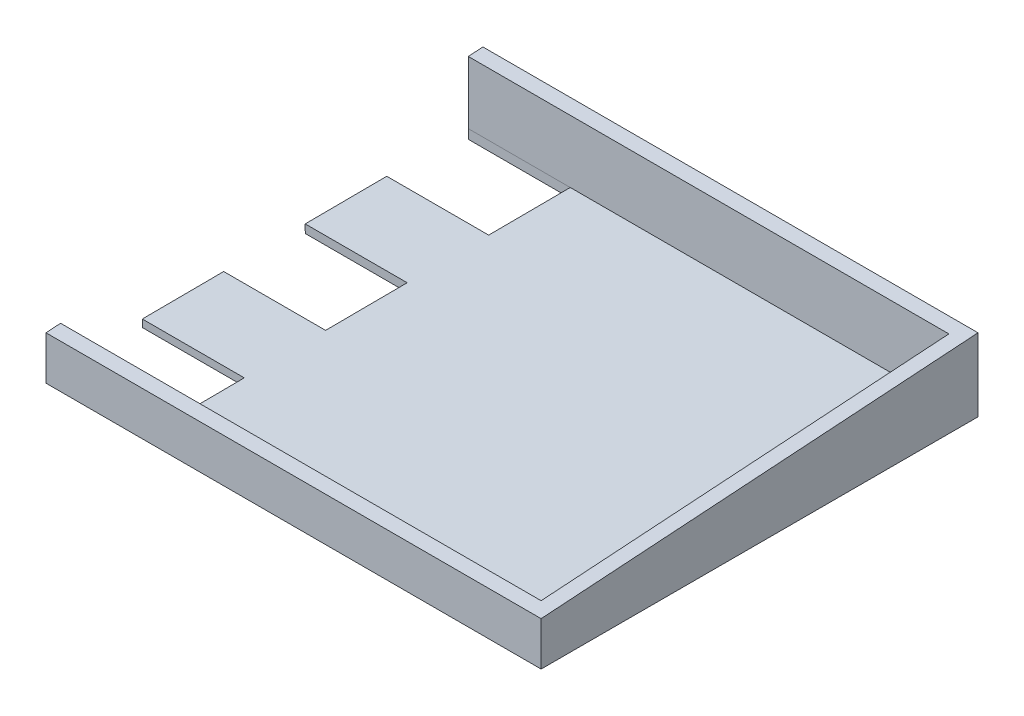
ISO-10303-21;
HEADER;
FILE_DESCRIPTION(('STEP AP214'),'2;1');
FILE_NAME('part.step','',(''),(''),'','','');
FILE_SCHEMA(('AUTOMOTIVE_DESIGN { 1 0 10303 214 1 1 1 1 }'));
ENDSEC;
DATA;
#1=APPLICATION_CONTEXT('core data for automotive mechanical design processes');
#2=APPLICATION_PROTOCOL_DEFINITION('international standard','automotive_design',2000,#1);
#3=PRODUCT_CONTEXT('',#1,'mechanical');
#4=PRODUCT('Part','Part','',(#3));
#5=PRODUCT_RELATED_PRODUCT_CATEGORY('part','',(#4));
#6=PRODUCT_DEFINITION_FORMATION('','',#4);
#7=PRODUCT_DEFINITION_CONTEXT('part definition',#1,'design');
#8=PRODUCT_DEFINITION('design','',#6,#7);
#9=PRODUCT_DEFINITION_SHAPE('','',#8);
#10=(LENGTH_UNIT() NAMED_UNIT(*) SI_UNIT(.MILLI.,.METRE.));
#11=(NAMED_UNIT(*) PLANE_ANGLE_UNIT() SI_UNIT($,.RADIAN.));
#12=(NAMED_UNIT(*) SI_UNIT($,.STERADIAN.) SOLID_ANGLE_UNIT());
#13=UNCERTAINTY_MEASURE_WITH_UNIT(LENGTH_MEASURE(1.E-05),#10,'distance_accuracy_value','');
#14=(GEOMETRIC_REPRESENTATION_CONTEXT(3) GLOBAL_UNCERTAINTY_ASSIGNED_CONTEXT((#13)) GLOBAL_UNIT_ASSIGNED_CONTEXT((#10,
#11,#12)) REPRESENTATION_CONTEXT('',''));
#15=CARTESIAN_POINT('',(0.,0.,0.));
#16=DIRECTION('',(0.,0.,1.));
#17=DIRECTION('',(1.,0.,0.));
#18=AXIS2_PLACEMENT_3D('',#15,#16,#17);
#19=CARTESIAN_POINT('',(-170.,0.,0.));
#20=DIRECTION('',(-1.,0.,0.));
#21=DIRECTION('',(0.,0.,1.));
#22=AXIS2_PLACEMENT_3D('',#19,#20,#21);
#23=PLANE('',#22);
#24=DIRECTION('',(0.,0.99998367386921,0.00571419242210977));
#25=VECTOR('',#24,1.);
#26=CARTESIAN_POINT('',(-170.,-15.6680463223183,-33.0918935943006));
#27=LINE('',#26,#25);
#28=CARTESIAN_POINT('',(-170.,-15.,-33.0880761867445));
#29=VERTEX_POINT('',#28);
#30=CARTESIAN_POINT('',(-170.,-12.4395803130451,-33.0734452171047));
#31=VERTEX_POINT('',#30);
#32=EDGE_CURVE('E208',#29,#31,#27,.T.);
#33=ORIENTED_EDGE('',*,*,#32,.T.);
#34=DIRECTION('',(0.,-0.00571419242210977,0.99998367386921));
#35=VECTOR('',#34,1.);
#36=CARTESIAN_POINT('',(-170.,-11.8,-145.));
#37=LINE('',#36,#35);
#38=CARTESIAN_POINT('',(-170.,-12.2799921634572,-61.0013713949864));
#39=VERTEX_POINT('',#38);
#40=EDGE_CURVE('E316',#39,#31,#37,.T.);
#41=ORIENTED_EDGE('',*,*,#40,.F.);
#42=DIRECTION('',(0.,0.99998367386921,0.00571419242210977));
#43=VECTOR('',#42,1.);
#44=CARTESIAN_POINT('',(-170.,-15.5084581727304,-61.0198197721822));
#45=LINE('',#44,#43);
#46=CARTESIAN_POINT('',(-170.,-15.,-61.0169142969095));
#47=VERTEX_POINT('',#46);
#48=EDGE_CURVE('E69',#47,#39,#45,.T.);
#49=ORIENTED_EDGE('',*,*,#48,.F.);
#50=DIRECTION('',(0.,0.,-1.));
#51=VECTOR('',#50,1.);
#52=CARTESIAN_POINT('',(-170.,-15.,-150.));
#53=LINE('',#52,#51);
#54=EDGE_CURVE('E349',#29,#47,#53,.T.);
#55=ORIENTED_EDGE('',*,*,#54,.F.);
#56=EDGE_LOOP('',(#33,#41,#49,#55));
#57=FACE_BOUND('',#56,.T.);
#58=ADVANCED_FACE('F43',(#57),#23,.T.);
#59=DIRECTION('',(0.,0.99998367386921,0.00571419242210977));
#60=VECTOR('',#59,1.);
#61=CARTESIAN_POINT('',(-170.,-15.3484607849113,-89.0193626405201));
#62=LINE('',#61,#60);
#63=CARTESIAN_POINT('',(-170.,-15.,-89.0173714360349));
#64=VERTEX_POINT('',#63);
#65=CARTESIAN_POINT('',(-170.,-12.1199947756382,-89.0009142633243));
#66=VERTEX_POINT('',#65);
#67=EDGE_CURVE('E234',#64,#66,#62,.T.);
#68=ORIENTED_EDGE('',*,*,#67,.T.);
#69=CARTESIAN_POINT('',(-170.,-11.9599973878191,-117.000457131662));
#70=VERTEX_POINT('',#69);
#71=EDGE_CURVE('E312',#70,#66,#37,.T.);
#72=ORIENTED_EDGE('',*,*,#71,.F.);
#73=DIRECTION('',(0.,0.99998367386921,0.00571419242210977));
#74=VECTOR('',#73,1.);
#75=CARTESIAN_POINT('',(-170.,-15.1884633970922,-117.018905508858));
#76=LINE('',#75,#74);
#77=CARTESIAN_POINT('',(-170.,-15.,-117.01782857516));
#78=VERTEX_POINT('',#77);
#79=EDGE_CURVE('E265',#78,#70,#76,.T.);
#80=ORIENTED_EDGE('',*,*,#79,.F.);
#81=EDGE_CURVE('E427',#64,#78,#53,.T.);
#82=ORIENTED_EDGE('',*,*,#81,.F.);
#83=EDGE_LOOP('',(#68,#72,#80,#82));
#84=FACE_BOUND('',#83,.T.);
#85=ADVANCED_FACE('F447',(#84),#23,.T.);
#86=DIRECTION('',(0.,0.99998367386921,0.00571419242210977));
#87=VECTOR('',#86,1.);
#88=CARTESIAN_POINT('',(-170.,-15.0284660092732,-145.018448377196));
#89=LINE('',#88,#87);
#90=CARTESIAN_POINT('',(-170.,-15.,-145.018285714286));
#91=VERTEX_POINT('',#90);
#92=CARTESIAN_POINT('',(-170.,-11.8,-145.));
#93=VERTEX_POINT('',#92);
#94=EDGE_CURVE('E266',#91,#93,#89,.T.);
#95=ORIENTED_EDGE('',*,*,#94,.T.);
#96=DIRECTION('',(0.,-1.,0.));
#97=VECTOR('',#96,1.);
#98=CARTESIAN_POINT('',(-170.,9.66666666666667,-145.));
#99=LINE('',#98,#97);
#100=CARTESIAN_POINT('',(-170.,9.66666666666668,-145.));
#101=VERTEX_POINT('',#100);
#102=EDGE_CURVE('E289',#101,#93,#99,.T.);
#103=ORIENTED_EDGE('',*,*,#102,.F.);
#104=DIRECTION('',(0.,-0.0665190105237741,0.997785157856609));
#105=VECTOR('',#104,1.);
#106=CARTESIAN_POINT('',(-170.,0.,0.));
#107=LINE('',#106,#105);
#108=CARTESIAN_POINT('',(-170.,10.,-150.));
#109=VERTEX_POINT('',#108);
#110=EDGE_CURVE('E334',#109,#101,#107,.T.);
#111=ORIENTED_EDGE('',*,*,#110,.F.);
#112=DIRECTION('',(0.,1.,0.));
#113=VECTOR('',#112,1.);
#114=CARTESIAN_POINT('',(-170.,10.,-150.));
#115=LINE('',#114,#113);
#116=CARTESIAN_POINT('',(-170.,-15.,-150.));
#117=VERTEX_POINT('',#116);
#118=EDGE_CURVE('E348',#117,#109,#115,.T.);
#119=ORIENTED_EDGE('',*,*,#118,.F.);
#120=EDGE_CURVE('E343',#91,#117,#53,.T.);
#121=ORIENTED_EDGE('',*,*,#120,.F.);
#122=EDGE_LOOP('',(#95,#103,#111,#119,#121));
#123=FACE_BOUND('',#122,.T.);
#124=ADVANCED_FACE('F392',(#123),#23,.T.);
#125=CARTESIAN_POINT('',(-170.,0.,0.));
#126=DIRECTION('',(0.,0.997785157856609,0.0665190105237741));
#127=DIRECTION('',(0.,-0.0665190105237741,0.997785157856609));
#128=AXIS2_PLACEMENT_3D('',#125,#126,#127);
#129=PLANE('',#128);
#130=DIRECTION('',(-1.,0.,0.));
#131=VECTOR('',#130,1.);
#132=CARTESIAN_POINT('',(-5.,0.333333333333335,-4.99999999999998));
#133=LINE('',#132,#131);
#134=CARTESIAN_POINT('',(-5.,0.333333333333335,-4.99999999999998));
#135=VERTEX_POINT('',#134);
#136=CARTESIAN_POINT('',(-170.,0.333333333333335,-4.99999999999998));
#137=VERTEX_POINT('',#136);
#138=EDGE_CURVE('E319',#135,#137,#133,.T.);
#139=ORIENTED_EDGE('',*,*,#138,.T.);
#140=CARTESIAN_POINT('',(-170.,0.,0.));
#141=VERTEX_POINT('',#140);
#142=EDGE_CURVE('E339',#137,#141,#107,.T.);
#143=ORIENTED_EDGE('',*,*,#142,.T.);
#144=DIRECTION('',(1.,0.,0.));
#145=VECTOR('',#144,1.);
#146=CARTESIAN_POINT('',(-170.,0.,0.));
#147=LINE('',#146,#145);
#148=CARTESIAN_POINT('',(0.,0.,0.));
#149=VERTEX_POINT('',#148);
#150=EDGE_CURVE('E47',#141,#149,#147,.T.);
#151=ORIENTED_EDGE('',*,*,#150,.T.);
#152=DIRECTION('',(0.,-0.0665190105237741,0.997785157856609));
#153=VECTOR('',#152,1.);
#154=CARTESIAN_POINT('',(0.,0.,0.));
#155=LINE('',#154,#153);
#156=CARTESIAN_POINT('',(0.,10.,-150.));
#157=VERTEX_POINT('',#156);
#158=EDGE_CURVE('E323',#157,#149,#155,.T.);
#159=ORIENTED_EDGE('',*,*,#158,.F.);
#160=DIRECTION('',(1.,0.,0.));
#161=VECTOR('',#160,1.);
#162=CARTESIAN_POINT('',(-170.,10.,-150.));
#163=LINE('',#162,#161);
#164=EDGE_CURVE('E11',#109,#157,#163,.T.);
#165=ORIENTED_EDGE('',*,*,#164,.F.);
#166=ORIENTED_EDGE('',*,*,#110,.T.);
#167=DIRECTION('',(-1.,0.,0.));
#168=VECTOR('',#167,1.);
#169=CARTESIAN_POINT('',(-5.,9.66666666666667,-145.));
#170=LINE('',#169,#168);
#171=CARTESIAN_POINT('',(-5.,9.66666666666667,-145.));
#172=VERTEX_POINT('',#171);
#173=EDGE_CURVE('E307',#172,#101,#170,.T.);
#174=ORIENTED_EDGE('',*,*,#173,.F.);
#175=DIRECTION('',(0.,0.0665190105237739,-0.997785157856609));
#176=VECTOR('',#175,1.);
#177=CARTESIAN_POINT('',(-5.,0.333333333333335,-4.99999999999998));
#178=LINE('',#177,#176);
#179=EDGE_CURVE('E290',#135,#172,#178,.T.);
#180=ORIENTED_EDGE('',*,*,#179,.F.);
#181=EDGE_LOOP('',(#139,#143,#151,#159,#165,#166,#174,#180));
#182=FACE_BOUND('',#181,.T.);
#183=ADVANCED_FACE('F45',(#182),#129,.T.);
#184=CARTESIAN_POINT('',(-170.,10.,-150.));
#185=DIRECTION('',(0.,0.,-1.));
#186=DIRECTION('',(-1.,0.,0.));
#187=AXIS2_PLACEMENT_3D('',#184,#185,#186);
#188=PLANE('',#187);
#189=DIRECTION('',(0.,1.,0.));
#190=VECTOR('',#189,1.);
#191=CARTESIAN_POINT('',(0.,10.,-150.));
#192=LINE('',#191,#190);
#193=CARTESIAN_POINT('',(0.,-15.,-150.));
#194=VERTEX_POINT('',#193);
#195=EDGE_CURVE('E364',#194,#157,#192,.T.);
#196=ORIENTED_EDGE('',*,*,#195,.F.);
#197=DIRECTION('',(1.,0.,0.));
#198=VECTOR('',#197,1.);
#199=CARTESIAN_POINT('',(-170.,-15.,-150.));
#200=LINE('',#199,#198);
#201=EDGE_CURVE('E53',#117,#194,#200,.T.);
#202=ORIENTED_EDGE('',*,*,#201,.F.);
#203=ORIENTED_EDGE('',*,*,#118,.T.);
#204=ORIENTED_EDGE('',*,*,#164,.T.);
#205=EDGE_LOOP('',(#196,#202,#203,#204));
#206=FACE_BOUND('',#205,.T.);
#207=ADVANCED_FACE('F386',(#206),#188,.T.);
#208=CARTESIAN_POINT('',(-170.,-15.,-150.));
#209=DIRECTION('',(0.,-1.,0.));
#210=DIRECTION('',(0.,0.,-1.));
#211=AXIS2_PLACEMENT_3D('',#208,#209,#210);
#212=PLANE('',#211);
#213=DIRECTION('',(1.,0.,0.));
#214=VECTOR('',#213,1.);
#215=CARTESIAN_POINT('',(-170.,-15.,-33.0880761867445));
#216=LINE('',#215,#214);
#217=CARTESIAN_POINT('',(-135.,-15.,-33.0880761867444));
#218=VERTEX_POINT('',#217);
#219=EDGE_CURVE('E221',#29,#218,#216,.T.);
#220=ORIENTED_EDGE('',*,*,#219,.F.);
#221=ORIENTED_EDGE('',*,*,#54,.T.);
#222=DIRECTION('',(-1.,0.,0.));
#223=VECTOR('',#222,1.);
#224=CARTESIAN_POINT('',(-170.,-15.,-61.0169142969095));
#225=LINE('',#224,#223);
#226=CARTESIAN_POINT('',(-135.,-15.,-61.0169142969095));
#227=VERTEX_POINT('',#226);
#228=EDGE_CURVE('E238',#227,#47,#225,.T.);
#229=ORIENTED_EDGE('',*,*,#228,.F.);
#230=DIRECTION('',(0.,0.,1.));
#231=VECTOR('',#230,1.);
#232=CARTESIAN_POINT('',(-135.,-15.,-150.));
#233=LINE('',#232,#231);
#234=CARTESIAN_POINT('',(-135.,-15.,-89.0173714360349));
#235=VERTEX_POINT('',#234);
#236=EDGE_CURVE('E249',#235,#227,#233,.T.);
#237=ORIENTED_EDGE('',*,*,#236,.F.);
#238=DIRECTION('',(1.,0.,0.));
#239=VECTOR('',#238,1.);
#240=CARTESIAN_POINT('',(-170.,-15.,-89.0173714360349));
#241=LINE('',#240,#239);
#242=EDGE_CURVE('E252',#64,#235,#241,.T.);
#243=ORIENTED_EDGE('',*,*,#242,.F.);
#244=ORIENTED_EDGE('',*,*,#81,.T.);
#245=DIRECTION('',(-1.,0.,0.));
#246=VECTOR('',#245,1.);
#247=CARTESIAN_POINT('',(-170.,-15.,-117.01782857516));
#248=LINE('',#247,#246);
#249=CARTESIAN_POINT('',(-135.,-15.,-117.01782857516));
#250=VERTEX_POINT('',#249);
#251=EDGE_CURVE('E282',#250,#78,#248,.T.);
#252=ORIENTED_EDGE('',*,*,#251,.F.);
#253=DIRECTION('',(0.,0.,1.));
#254=VECTOR('',#253,1.);
#255=CARTESIAN_POINT('',(-135.,-15.,-150.));
#256=LINE('',#255,#254);
#257=CARTESIAN_POINT('',(-135.,-15.,-145.018285714286));
#258=VERTEX_POINT('',#257);
#259=EDGE_CURVE('E286',#258,#250,#256,.T.);
#260=ORIENTED_EDGE('',*,*,#259,.F.);
#261=DIRECTION('',(1.,0.,0.));
#262=VECTOR('',#261,1.);
#263=CARTESIAN_POINT('',(-170.,-15.,-145.018285714286));
#264=LINE('',#263,#262);
#265=EDGE_CURVE('E270',#91,#258,#264,.T.);
#266=ORIENTED_EDGE('',*,*,#265,.F.);
#267=ORIENTED_EDGE('',*,*,#120,.T.);
#268=ORIENTED_EDGE('',*,*,#201,.T.);
#269=DIRECTION('',(0.,0.,-1.));
#270=VECTOR('',#269,1.);
#271=CARTESIAN_POINT('',(0.,-15.,-150.));
#272=LINE('',#271,#270);
#273=CARTESIAN_POINT('',(0.,-15.,0.));
#274=VERTEX_POINT('',#273);
#275=EDGE_CURVE('E360',#274,#194,#272,.T.);
#276=ORIENTED_EDGE('',*,*,#275,.F.);
#277=DIRECTION('',(1.,0.,0.));
#278=VECTOR('',#277,1.);
#279=CARTESIAN_POINT('',(-170.,-15.,0.));
#280=LINE('',#279,#278);
#281=CARTESIAN_POINT('',(-170.,-15.,0.));
#282=VERTEX_POINT('',#281);
#283=EDGE_CURVE('E369',#282,#274,#280,.T.);
#284=ORIENTED_EDGE('',*,*,#283,.F.);
#285=CARTESIAN_POINT('',(-170.,-15.,-5.08761904761903));
#286=VERTEX_POINT('',#285);
#287=EDGE_CURVE('E344',#282,#286,#53,.T.);
#288=ORIENTED_EDGE('',*,*,#287,.T.);
#289=DIRECTION('',(-1.,0.,0.));
#290=VECTOR('',#289,1.);
#291=CARTESIAN_POINT('',(-170.,-15.,-5.08761904761901));
#292=LINE('',#291,#290);
#293=CARTESIAN_POINT('',(-135.,-15.,-5.08761904761903));
#294=VERTEX_POINT('',#293);
#295=EDGE_CURVE('E212',#294,#286,#292,.T.);
#296=ORIENTED_EDGE('',*,*,#295,.F.);
#297=DIRECTION('',(0.,0.,1.));
#298=VECTOR('',#297,1.);
#299=CARTESIAN_POINT('',(-135.,-15.,-150.));
#300=LINE('',#299,#298);
#301=EDGE_CURVE('E189',#218,#294,#300,.T.);
#302=ORIENTED_EDGE('',*,*,#301,.F.);
#303=EDGE_LOOP('',(#220,#221,#229,#237,#243,#244,#252,#260,#266,#267,#268,#276,#284,#288,#296,#302));
#304=FACE_BOUND('',#303,.T.);
#305=ADVANCED_FACE('F424',(#304),#212,.T.);
#306=CARTESIAN_POINT('',(-170.,-15.,0.));
#307=DIRECTION('',(0.,0.,1.));
#308=DIRECTION('',(1.,0.,0.));
#309=AXIS2_PLACEMENT_3D('',#306,#307,#308);
#310=PLANE('',#309);
#311=DIRECTION('',(0.,-1.,0.));
#312=VECTOR('',#311,1.);
#313=CARTESIAN_POINT('',(0.,-15.,0.));
#314=LINE('',#313,#312);
#315=EDGE_CURVE('E356',#149,#274,#314,.T.);
#316=ORIENTED_EDGE('',*,*,#315,.F.);
#317=ORIENTED_EDGE('',*,*,#150,.F.);
#318=DIRECTION('',(0.,-1.,0.));
#319=VECTOR('',#318,1.);
#320=CARTESIAN_POINT('',(-170.,-15.,0.));
#321=LINE('',#320,#319);
#322=EDGE_CURVE('E338',#141,#282,#321,.T.);
#323=ORIENTED_EDGE('',*,*,#322,.T.);
#324=ORIENTED_EDGE('',*,*,#283,.T.);
#325=EDGE_LOOP('',(#316,#317,#323,#324));
#326=FACE_BOUND('',#325,.T.);
#327=ADVANCED_FACE('F380',(#326),#310,.T.);
#328=DIRECTION('',(0.,0.99998367386921,0.00571419242210977));
#329=VECTOR('',#328,1.);
#330=CARTESIAN_POINT('',(-170.,-15.8280437101374,-5.09235072596267));
#331=LINE('',#330,#329);
#332=CARTESIAN_POINT('',(-170.,-12.5995777008642,-5.07390234876684));
#333=VERTEX_POINT('',#332);
#334=EDGE_CURVE('E61',#286,#333,#331,.T.);
#335=ORIENTED_EDGE('',*,*,#334,.F.);
#336=ORIENTED_EDGE('',*,*,#287,.F.);
#337=ORIENTED_EDGE('',*,*,#322,.F.);
#338=ORIENTED_EDGE('',*,*,#142,.F.);
#339=DIRECTION('',(0.,1.,0.));
#340=VECTOR('',#339,1.);
#341=CARTESIAN_POINT('',(-170.,-12.6,-4.99999999999998));
#342=LINE('',#341,#340);
#343=CARTESIAN_POINT('',(-170.,-12.6,-4.99999999999998));
#344=VERTEX_POINT('',#343);
#345=EDGE_CURVE('E295',#344,#137,#342,.T.);
#346=ORIENTED_EDGE('',*,*,#345,.F.);
#347=EDGE_CURVE('E311',#333,#344,#37,.T.);
#348=ORIENTED_EDGE('',*,*,#347,.F.);
#349=EDGE_LOOP('',(#335,#336,#337,#338,#346,#348));
#350=FACE_BOUND('',#349,.T.);
#351=ADVANCED_FACE('F406',(#350),#23,.T.);
#352=CARTESIAN_POINT('',(0.,0.,0.));
#353=DIRECTION('',(-1.,0.,0.));
#354=DIRECTION('',(0.,0.,1.));
#355=AXIS2_PLACEMENT_3D('',#352,#353,#354);
#356=PLANE('',#355);
#357=ORIENTED_EDGE('',*,*,#158,.T.);
#358=ORIENTED_EDGE('',*,*,#315,.T.);
#359=ORIENTED_EDGE('',*,*,#275,.T.);
#360=ORIENTED_EDGE('',*,*,#195,.T.);
#361=EDGE_LOOP('',(#357,#358,#359,#360));
#362=FACE_BOUND('',#361,.T.);
#363=ADVANCED_FACE('F382',(#362),#356,.F.);
#364=CARTESIAN_POINT('',(-5.,-12.6,-4.99999999999998));
#365=DIRECTION('',(0.,0.,1.));
#366=DIRECTION('',(1.,0.,0.));
#367=AXIS2_PLACEMENT_3D('',#364,#365,#366);
#368=PLANE('',#367);
#369=ORIENTED_EDGE('',*,*,#345,.T.);
#370=ORIENTED_EDGE('',*,*,#138,.F.);
#371=DIRECTION('',(0.,1.,0.));
#372=VECTOR('',#371,1.);
#373=CARTESIAN_POINT('',(-5.,-12.6,-4.99999999999998));
#374=LINE('',#373,#372);
#375=CARTESIAN_POINT('',(-5.,-12.6,-4.99999999999998));
#376=VERTEX_POINT('',#375);
#377=EDGE_CURVE('E303',#376,#135,#374,.T.);
#378=ORIENTED_EDGE('',*,*,#377,.F.);
#379=DIRECTION('',(-1.,0.,0.));
#380=VECTOR('',#379,1.);
#381=CARTESIAN_POINT('',(-5.,-12.6,-4.99999999999998));
#382=LINE('',#381,#380);
#383=EDGE_CURVE('E324',#376,#344,#382,.T.);
#384=ORIENTED_EDGE('',*,*,#383,.T.);
#385=EDGE_LOOP('',(#369,#370,#378,#384));
#386=FACE_BOUND('',#385,.T.);
#387=ADVANCED_FACE('F403',(#386),#368,.F.);
#388=CARTESIAN_POINT('',(-5.,-11.8,-145.));
#389=DIRECTION('',(0.,-0.99998367386921,-0.00571419242210977));
#390=DIRECTION('',(0.,0.00571419242210977,-0.99998367386921));
#391=AXIS2_PLACEMENT_3D('',#388,#389,#390);
#392=PLANE('',#391);
#393=ORIENTED_EDGE('',*,*,#40,.T.);
#394=DIRECTION('',(-1.,0.,0.));
#395=VECTOR('',#394,1.);
#396=CARTESIAN_POINT('',(-170.,-12.4395803130451,-33.0734452171047));
#397=LINE('',#396,#395);
#398=CARTESIAN_POINT('',(-135.,-12.4395803130451,-33.0734452171047));
#399=VERTEX_POINT('',#398);
#400=EDGE_CURVE('E202',#399,#31,#397,.T.);
#401=ORIENTED_EDGE('',*,*,#400,.F.);
#402=DIRECTION('',(0.,0.00571419242210979,-0.99998367386921));
#403=VECTOR('',#402,1.);
#404=CARTESIAN_POINT('',(-135.,-12.5995777008642,-5.07390234876682));
#405=LINE('',#404,#403);
#406=CARTESIAN_POINT('',(-135.,-12.5995777008642,-5.07390234876682));
#407=VERTEX_POINT('',#406);
#408=EDGE_CURVE('E186',#407,#399,#405,.T.);
#409=ORIENTED_EDGE('',*,*,#408,.F.);
#410=DIRECTION('',(1.,0.,0.));
#411=VECTOR('',#410,1.);
#412=CARTESIAN_POINT('',(-170.,-12.5995777008642,-5.07390234876682));
#413=LINE('',#412,#411);
#414=EDGE_CURVE('E194',#333,#407,#413,.T.);
#415=ORIENTED_EDGE('',*,*,#414,.F.);
#416=ORIENTED_EDGE('',*,*,#347,.T.);
#417=ORIENTED_EDGE('',*,*,#383,.F.);
#418=DIRECTION('',(0.,-0.00571419242210977,0.99998367386921));
#419=VECTOR('',#418,1.);
#420=CARTESIAN_POINT('',(-5.,-11.8,-145.));
#421=LINE('',#420,#419);
#422=CARTESIAN_POINT('',(-5.,-11.8,-145.));
#423=VERTEX_POINT('',#422);
#424=EDGE_CURVE('E299',#423,#376,#421,.T.);
#425=ORIENTED_EDGE('',*,*,#424,.F.);
#426=DIRECTION('',(-1.,0.,0.));
#427=VECTOR('',#426,1.);
#428=CARTESIAN_POINT('',(-5.,-11.8,-145.));
#429=LINE('',#428,#427);
#430=CARTESIAN_POINT('',(-135.,-11.8,-145.));
#431=VERTEX_POINT('',#430);
#432=EDGE_CURVE('E328',#423,#431,#429,.T.);
#433=ORIENTED_EDGE('',*,*,#432,.T.);
#434=DIRECTION('',(0.,0.00571419242210979,-0.99998367386921));
#435=VECTOR('',#434,1.);
#436=CARTESIAN_POINT('',(-135.,-11.8,-145.));
#437=LINE('',#436,#435);
#438=CARTESIAN_POINT('',(-135.,-11.9599973878191,-117.000457131662));
#439=VERTEX_POINT('',#438);
#440=EDGE_CURVE('E259',#439,#431,#437,.T.);
#441=ORIENTED_EDGE('',*,*,#440,.F.);
#442=DIRECTION('',(1.,0.,0.));
#443=VECTOR('',#442,1.);
#444=CARTESIAN_POINT('',(-170.,-11.9599973878191,-117.000457131662));
#445=LINE('',#444,#443);
#446=EDGE_CURVE('E255',#70,#439,#445,.T.);
#447=ORIENTED_EDGE('',*,*,#446,.F.);
#448=ORIENTED_EDGE('',*,*,#71,.T.);
#449=DIRECTION('',(-1.,0.,0.));
#450=VECTOR('',#449,1.);
#451=CARTESIAN_POINT('',(-170.,-12.1199947756382,-89.0009142633243));
#452=LINE('',#451,#450);
#453=CARTESIAN_POINT('',(-135.,-12.1199947756382,-89.0009142633243));
#454=VERTEX_POINT('',#453);
#455=EDGE_CURVE('E231',#454,#66,#452,.T.);
#456=ORIENTED_EDGE('',*,*,#455,.F.);
#457=DIRECTION('',(0.,0.00571419242210972,-0.99998367386921));
#458=VECTOR('',#457,1.);
#459=CARTESIAN_POINT('',(-135.,-12.1199947756382,-89.0009142633243));
#460=LINE('',#459,#458);
#461=CARTESIAN_POINT('',(-135.,-12.2799921634572,-61.0013713949864));
#462=VERTEX_POINT('',#461);
#463=EDGE_CURVE('E227',#462,#454,#460,.T.);
#464=ORIENTED_EDGE('',*,*,#463,.F.);
#465=DIRECTION('',(1.,0.,0.));
#466=VECTOR('',#465,1.);
#467=CARTESIAN_POINT('',(-135.,-12.2799921634572,-61.0013713949864));
#468=LINE('',#467,#466);
#469=EDGE_CURVE('E224',#39,#462,#468,.T.);
#470=ORIENTED_EDGE('',*,*,#469,.F.);
#471=EDGE_LOOP('',(#393,#401,#409,#415,#416,#417,#425,#433,#441,#447,#448,#456,#464,#470));
#472=FACE_BOUND('',#471,.T.);
#473=ADVANCED_FACE('F201',(#472),#392,.F.);
#474=CARTESIAN_POINT('',(-5.,9.66666666666667,-145.));
#475=DIRECTION('',(0.,0.,-1.));
#476=DIRECTION('',(-1.,0.,0.));
#477=AXIS2_PLACEMENT_3D('',#474,#475,#476);
#478=PLANE('',#477);
#479=ORIENTED_EDGE('',*,*,#102,.T.);
#480=DIRECTION('',(-1.,0.,0.));
#481=VECTOR('',#480,1.);
#482=CARTESIAN_POINT('',(-170.,-11.8,-145.));
#483=LINE('',#482,#481);
#484=EDGE_CURVE('E262',#431,#93,#483,.T.);
#485=ORIENTED_EDGE('',*,*,#484,.F.);
#486=ORIENTED_EDGE('',*,*,#432,.F.);
#487=DIRECTION('',(0.,-1.,0.));
#488=VECTOR('',#487,1.);
#489=CARTESIAN_POINT('',(-5.,9.66666666666667,-145.));
#490=LINE('',#489,#488);
#491=EDGE_CURVE('E294',#172,#423,#490,.T.);
#492=ORIENTED_EDGE('',*,*,#491,.F.);
#493=ORIENTED_EDGE('',*,*,#173,.T.);
#494=EDGE_LOOP('',(#479,#485,#486,#492,#493));
#495=FACE_BOUND('',#494,.T.);
#496=ADVANCED_FACE('F396',(#495),#478,.F.);
#497=CARTESIAN_POINT('',(-5.,0.,0.));
#498=DIRECTION('',(-1.,0.,0.));
#499=DIRECTION('',(0.,0.,1.));
#500=AXIS2_PLACEMENT_3D('',#497,#498,#499);
#501=PLANE('',#500);
#502=ORIENTED_EDGE('',*,*,#179,.T.);
#503=ORIENTED_EDGE('',*,*,#491,.T.);
#504=ORIENTED_EDGE('',*,*,#424,.T.);
#505=ORIENTED_EDGE('',*,*,#377,.T.);
#506=EDGE_LOOP('',(#502,#503,#504,#505));
#507=FACE_BOUND('',#506,.T.);
#508=ADVANCED_FACE('F399',(#507),#501,.T.);
#509=CARTESIAN_POINT('',(-170.,-15.0284660092732,-145.018448377196));
#510=DIRECTION('',(0.,0.00571419242210977,-0.99998367386921));
#511=DIRECTION('',(0.,0.99998367386921,0.00571419242210977));
#512=AXIS2_PLACEMENT_3D('',#509,#510,#511);
#513=PLANE('',#512);
#514=ORIENTED_EDGE('',*,*,#265,.T.);
#515=DIRECTION('',(0.,0.99998367386921,0.00571419242210977));
#516=VECTOR('',#515,1.);
#517=CARTESIAN_POINT('',(-135.,-15.0284660092732,-145.018448377196));
#518=LINE('',#517,#516);
#519=EDGE_CURVE('E271',#258,#431,#518,.T.);
#520=ORIENTED_EDGE('',*,*,#519,.T.);
#521=ORIENTED_EDGE('',*,*,#484,.T.);
#522=ORIENTED_EDGE('',*,*,#94,.F.);
#523=EDGE_LOOP('',(#514,#520,#521,#522));
#524=FACE_BOUND('',#523,.T.);
#525=ADVANCED_FACE('F420',(#524),#513,.F.);
#526=CARTESIAN_POINT('',(-135.,-15.0284660092732,-145.018448377196));
#527=DIRECTION('',(1.,0.,0.));
#528=DIRECTION('',(0.,0.,-1.));
#529=AXIS2_PLACEMENT_3D('',#526,#527,#528);
#530=PLANE('',#529);
#531=ORIENTED_EDGE('',*,*,#259,.T.);
#532=DIRECTION('',(0.,0.99998367386921,0.00571419242210977));
#533=VECTOR('',#532,1.);
#534=CARTESIAN_POINT('',(-135.,-15.1884633970922,-117.018905508858));
#535=LINE('',#534,#533);
#536=EDGE_CURVE('E275',#250,#439,#535,.T.);
#537=ORIENTED_EDGE('',*,*,#536,.T.);
#538=ORIENTED_EDGE('',*,*,#440,.T.);
#539=ORIENTED_EDGE('',*,*,#519,.F.);
#540=EDGE_LOOP('',(#531,#537,#538,#539));
#541=FACE_BOUND('',#540,.T.);
#542=ADVANCED_FACE('F416',(#541),#530,.F.);
#543=CARTESIAN_POINT('',(-170.,-15.1884633970922,-117.018905508858));
#544=DIRECTION('',(0.,-0.00571419242210977,0.99998367386921));
#545=DIRECTION('',(0.,-0.99998367386921,-0.00571419242210977));
#546=AXIS2_PLACEMENT_3D('',#543,#544,#545);
#547=PLANE('',#546);
#548=ORIENTED_EDGE('',*,*,#251,.T.);
#549=ORIENTED_EDGE('',*,*,#79,.T.);
#550=ORIENTED_EDGE('',*,*,#446,.T.);
#551=ORIENTED_EDGE('',*,*,#536,.F.);
#552=EDGE_LOOP('',(#548,#549,#550,#551));
#553=FACE_BOUND('',#552,.T.);
#554=ADVANCED_FACE('F449',(#553),#547,.F.);
#555=CARTESIAN_POINT('',(-170.,-15.3484607849113,-89.0193626405201));
#556=DIRECTION('',(0.,0.00571419242210977,-0.99998367386921));
#557=DIRECTION('',(0.,0.99998367386921,0.00571419242210977));
#558=AXIS2_PLACEMENT_3D('',#555,#556,#557);
#559=PLANE('',#558);
#560=ORIENTED_EDGE('',*,*,#242,.T.);
#561=DIRECTION('',(0.,0.99998367386921,0.00571419242210977));
#562=VECTOR('',#561,1.);
#563=CARTESIAN_POINT('',(-135.,-15.3484607849113,-89.0193626405201));
#564=LINE('',#563,#562);
#565=EDGE_CURVE('E239',#235,#454,#564,.T.);
#566=ORIENTED_EDGE('',*,*,#565,.T.);
#567=ORIENTED_EDGE('',*,*,#455,.T.);
#568=ORIENTED_EDGE('',*,*,#67,.F.);
#569=EDGE_LOOP('',(#560,#566,#567,#568));
#570=FACE_BOUND('',#569,.T.);
#571=ADVANCED_FACE('F451',(#570),#559,.F.);
#572=CARTESIAN_POINT('',(-135.,-15.3484607849113,-89.0193626405201));
#573=DIRECTION('',(1.,0.,0.));
#574=DIRECTION('',(0.,0.,-1.));
#575=AXIS2_PLACEMENT_3D('',#572,#573,#574);
#576=PLANE('',#575);
#577=ORIENTED_EDGE('',*,*,#236,.T.);
#578=DIRECTION('',(0.,0.99998367386921,0.00571419242210977));
#579=VECTOR('',#578,1.);
#580=CARTESIAN_POINT('',(-135.,-15.5084581727304,-61.0198197721822));
#581=LINE('',#580,#579);
#582=EDGE_CURVE('E242',#227,#462,#581,.T.);
#583=ORIENTED_EDGE('',*,*,#582,.T.);
#584=ORIENTED_EDGE('',*,*,#463,.T.);
#585=ORIENTED_EDGE('',*,*,#565,.F.);
#586=EDGE_LOOP('',(#577,#583,#584,#585));
#587=FACE_BOUND('',#586,.T.);
#588=ADVANCED_FACE('F443',(#587),#576,.F.);
#589=CARTESIAN_POINT('',(-135.,-15.5084581727304,-61.0198197721822));
#590=DIRECTION('',(0.,-0.00571419242210977,0.99998367386921));
#591=DIRECTION('',(0.,-0.99998367386921,-0.00571419242210977));
#592=AXIS2_PLACEMENT_3D('',#589,#590,#591);
#593=PLANE('',#592);
#594=ORIENTED_EDGE('',*,*,#228,.T.);
#595=ORIENTED_EDGE('',*,*,#48,.T.);
#596=ORIENTED_EDGE('',*,*,#469,.T.);
#597=ORIENTED_EDGE('',*,*,#582,.F.);
#598=EDGE_LOOP('',(#594,#595,#596,#597));
#599=FACE_BOUND('',#598,.T.);
#600=ADVANCED_FACE('F437',(#599),#593,.F.);
#601=CARTESIAN_POINT('',(-170.,-15.6680463223183,-33.0918935943006));
#602=DIRECTION('',(0.,0.00571419242210977,-0.99998367386921));
#603=DIRECTION('',(0.,0.99998367386921,0.00571419242210977));
#604=AXIS2_PLACEMENT_3D('',#601,#602,#603);
#605=PLANE('',#604);
#606=ORIENTED_EDGE('',*,*,#219,.T.);
#607=DIRECTION('',(0.,0.99998367386921,0.00571419242210977));
#608=VECTOR('',#607,1.);
#609=CARTESIAN_POINT('',(-135.,-15.6680463223183,-33.0918935943006));
#610=LINE('',#609,#608);
#611=EDGE_CURVE('E192',#218,#399,#610,.T.);
#612=ORIENTED_EDGE('',*,*,#611,.T.);
#613=ORIENTED_EDGE('',*,*,#400,.T.);
#614=ORIENTED_EDGE('',*,*,#32,.F.);
#615=EDGE_LOOP('',(#606,#612,#613,#614));
#616=FACE_BOUND('',#615,.T.);
#617=ADVANCED_FACE('F588',(#616),#605,.F.);
#618=CARTESIAN_POINT('',(-135.,-15.8280437101374,-5.09235072596267));
#619=DIRECTION('',(1.,0.,0.));
#620=DIRECTION('',(0.,0.,-1.));
#621=AXIS2_PLACEMENT_3D('',#618,#619,#620);
#622=PLANE('',#621);
#623=ORIENTED_EDGE('',*,*,#301,.T.);
#624=DIRECTION('',(0.,0.99998367386921,0.00571419242210977));
#625=VECTOR('',#624,1.);
#626=CARTESIAN_POINT('',(-135.,-15.8280437101374,-5.09235072596267));
#627=LINE('',#626,#625);
#628=EDGE_CURVE('E182',#294,#407,#627,.T.);
#629=ORIENTED_EDGE('',*,*,#628,.T.);
#630=ORIENTED_EDGE('',*,*,#408,.T.);
#631=ORIENTED_EDGE('',*,*,#611,.F.);
#632=EDGE_LOOP('',(#623,#629,#630,#631));
#633=FACE_BOUND('',#632,.T.);
#634=ADVANCED_FACE('F183',(#633),#622,.F.);
#635=CARTESIAN_POINT('',(-170.,-15.8280437101374,-5.09235072596267));
#636=DIRECTION('',(0.,-0.00571419242210977,0.99998367386921));
#637=DIRECTION('',(0.,-0.99998367386921,-0.00571419242210977));
#638=AXIS2_PLACEMENT_3D('',#635,#636,#637);
#639=PLANE('',#638);
#640=ORIENTED_EDGE('',*,*,#295,.T.);
#641=ORIENTED_EDGE('',*,*,#334,.T.);
#642=ORIENTED_EDGE('',*,*,#414,.T.);
#643=ORIENTED_EDGE('',*,*,#628,.F.);
#644=EDGE_LOOP('',(#640,#641,#642,#643));
#645=FACE_BOUND('',#644,.T.);
#646=ADVANCED_FACE('F195',(#645),#639,.F.);
#647=CLOSED_SHELL('',(#58,#85,#124,#183,#207,#305,#327,#351,#363,#387,#473,#496,#508,#525,#542,
#554,#571,#588,#600,#617,#634,#646));
#648=MANIFOLD_SOLID_BREP('B2',#647);
#649=ADVANCED_BREP_SHAPE_REPRESENTATION('',(#18,#648),#14);
#650=SHAPE_DEFINITION_REPRESENTATION(#9,#649);
ENDSEC;
END-ISO-10303-21;
